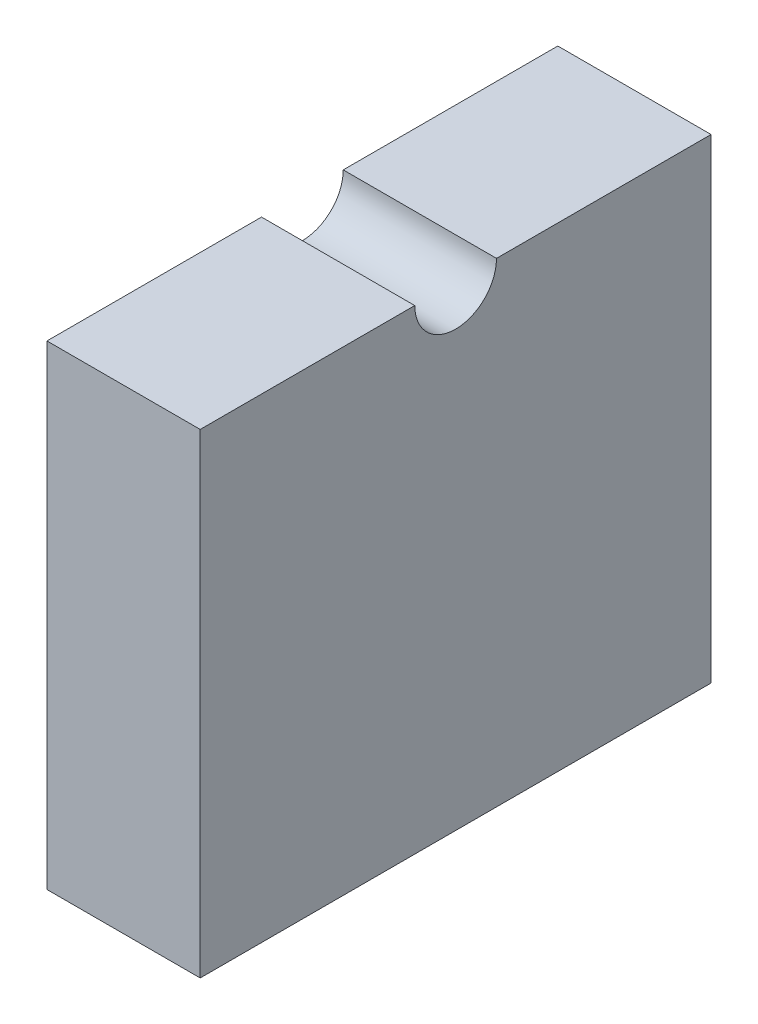
ISO-10303-21;
HEADER;
FILE_DESCRIPTION(('STEP AP214'),'2;1');
FILE_NAME('part.step','',(''),(''),'','','');
FILE_SCHEMA(('AUTOMOTIVE_DESIGN { 1 0 10303 214 1 1 1 1 }'));
ENDSEC;
DATA;
#1=APPLICATION_CONTEXT('core data for automotive mechanical design processes');
#2=APPLICATION_PROTOCOL_DEFINITION('international standard','automotive_design',2000,#1);
#3=PRODUCT_CONTEXT('',#1,'mechanical');
#4=PRODUCT('Part','Part','',(#3));
#5=PRODUCT_RELATED_PRODUCT_CATEGORY('part','',(#4));
#6=PRODUCT_DEFINITION_FORMATION('','',#4);
#7=PRODUCT_DEFINITION_CONTEXT('part definition',#1,'design');
#8=PRODUCT_DEFINITION('design','',#6,#7);
#9=PRODUCT_DEFINITION_SHAPE('','',#8);
#10=(LENGTH_UNIT() NAMED_UNIT(*) SI_UNIT(.MILLI.,.METRE.));
#11=(NAMED_UNIT(*) PLANE_ANGLE_UNIT() SI_UNIT($,.RADIAN.));
#12=(NAMED_UNIT(*) SI_UNIT($,.STERADIAN.) SOLID_ANGLE_UNIT());
#13=UNCERTAINTY_MEASURE_WITH_UNIT(LENGTH_MEASURE(1.E-05),#10,'distance_accuracy_value','');
#14=(GEOMETRIC_REPRESENTATION_CONTEXT(3) GLOBAL_UNCERTAINTY_ASSIGNED_CONTEXT((#13)) GLOBAL_UNIT_ASSIGNED_CONTEXT((#10,
#11,#12)) REPRESENTATION_CONTEXT('',''));
#15=CARTESIAN_POINT('',(0.,0.,0.));
#16=DIRECTION('',(0.,0.,1.));
#17=DIRECTION('',(1.,0.,0.));
#18=AXIS2_PLACEMENT_3D('',#15,#16,#17);
#19=CARTESIAN_POINT('',(15.,23.25,-25.));
#20=DIRECTION('',(0.,0.,1.));
#21=DIRECTION('',(0.,-1.,0.));
#22=AXIS2_PLACEMENT_3D('',#19,#20,#21);
#23=PLANE('',#22);
#24=DIRECTION('',(0.,1.,0.));
#25=VECTOR('',#24,1.);
#26=CARTESIAN_POINT('',(0.,23.25,-25.));
#27=LINE('',#26,#25);
#28=CARTESIAN_POINT('',(0.,-23.25,-25.));
#29=VERTEX_POINT('',#28);
#30=CARTESIAN_POINT('',(0.,23.25,-25.));
#31=VERTEX_POINT('',#30);
#32=EDGE_CURVE('E117',#29,#31,#27,.T.);
#33=ORIENTED_EDGE('',*,*,#32,.T.);
#34=DIRECTION('',(-1.,0.,0.));
#35=VECTOR('',#34,1.);
#36=CARTESIAN_POINT('',(15.,23.25,-25.));
#37=LINE('',#36,#35);
#38=CARTESIAN_POINT('',(15.,23.25,-25.));
#39=VERTEX_POINT('',#38);
#40=EDGE_CURVE('E11',#39,#31,#37,.T.);
#41=ORIENTED_EDGE('',*,*,#40,.F.);
#42=DIRECTION('',(0.,1.,0.));
#43=VECTOR('',#42,1.);
#44=CARTESIAN_POINT('',(15.,23.25,-25.));
#45=LINE('',#44,#43);
#46=CARTESIAN_POINT('',(15.,-23.25,-25.));
#47=VERTEX_POINT('',#46);
#48=EDGE_CURVE('E127',#47,#39,#45,.T.);
#49=ORIENTED_EDGE('',*,*,#48,.F.);
#50=DIRECTION('',(-1.,0.,0.));
#51=VECTOR('',#50,1.);
#52=CARTESIAN_POINT('',(15.,-23.25,-25.));
#53=LINE('',#52,#51);
#54=EDGE_CURVE('E113',#47,#29,#53,.T.);
#55=ORIENTED_EDGE('',*,*,#54,.T.);
#56=EDGE_LOOP('',(#33,#41,#49,#55));
#57=FACE_BOUND('',#56,.T.);
#58=ADVANCED_FACE('F33',(#57),#23,.F.);
#59=CARTESIAN_POINT('',(15.,23.25,-4.));
#60=DIRECTION('',(0.,-1.,0.));
#61=DIRECTION('',(0.,0.,-1.));
#62=AXIS2_PLACEMENT_3D('',#59,#60,#61);
#63=PLANE('',#62);
#64=DIRECTION('',(0.,0.,1.));
#65=VECTOR('',#64,1.);
#66=CARTESIAN_POINT('',(0.,23.25,-4.));
#67=LINE('',#66,#65);
#68=CARTESIAN_POINT('',(0.,23.25,-4.));
#69=VERTEX_POINT('',#68);
#70=EDGE_CURVE('E120',#31,#69,#67,.T.);
#71=ORIENTED_EDGE('',*,*,#70,.T.);
#72=DIRECTION('',(-1.,0.,0.));
#73=VECTOR('',#72,1.);
#74=CARTESIAN_POINT('',(15.,23.25,-4.));
#75=LINE('',#74,#73);
#76=CARTESIAN_POINT('',(15.,23.25,-4.));
#77=VERTEX_POINT('',#76);
#78=EDGE_CURVE('E41',#77,#69,#75,.T.);
#79=ORIENTED_EDGE('',*,*,#78,.F.);
#80=DIRECTION('',(0.,0.,1.));
#81=VECTOR('',#80,1.);
#82=CARTESIAN_POINT('',(15.,23.25,-4.));
#83=LINE('',#82,#81);
#84=EDGE_CURVE('E86',#39,#77,#83,.T.);
#85=ORIENTED_EDGE('',*,*,#84,.F.);
#86=ORIENTED_EDGE('',*,*,#40,.T.);
#87=EDGE_LOOP('',(#71,#79,#85,#86));
#88=FACE_BOUND('',#87,.T.);
#89=ADVANCED_FACE('F151',(#88),#63,.F.);
#90=CARTESIAN_POINT('',(15.,23.25,0.));
#91=DIRECTION('',(-1.,0.,0.));
#92=DIRECTION('',(0.,0.,1.));
#93=AXIS2_PLACEMENT_3D('',#90,#91,#92);
#94=CYLINDRICAL_SURFACE('',#93,4.);
#95=CARTESIAN_POINT('',(0.,23.25,0.));
#96=DIRECTION('',(-1.,0.,0.));
#97=DIRECTION('',(0.,0.,-1.));
#98=AXIS2_PLACEMENT_3D('',#95,#96,#97);
#99=CIRCLE('',#98,4.);
#100=CARTESIAN_POINT('',(0.,23.25,4.));
#101=VERTEX_POINT('',#100);
#102=EDGE_CURVE('E122',#69,#101,#99,.T.);
#103=ORIENTED_EDGE('',*,*,#102,.T.);
#104=DIRECTION('',(-1.,0.,0.));
#105=VECTOR('',#104,1.);
#106=CARTESIAN_POINT('',(15.,23.25,4.));
#107=LINE('',#106,#105);
#108=CARTESIAN_POINT('',(15.,23.25,4.));
#109=VERTEX_POINT('',#108);
#110=EDGE_CURVE('E108',#109,#101,#107,.T.);
#111=ORIENTED_EDGE('',*,*,#110,.F.);
#112=CARTESIAN_POINT('',(15.,23.25,0.));
#113=DIRECTION('',(-1.,0.,0.));
#114=DIRECTION('',(0.,0.,-1.));
#115=AXIS2_PLACEMENT_3D('',#112,#113,#114);
#116=CIRCLE('',#115,4.);
#117=EDGE_CURVE('E99',#77,#109,#116,.T.);
#118=ORIENTED_EDGE('',*,*,#117,.F.);
#119=ORIENTED_EDGE('',*,*,#78,.T.);
#120=EDGE_LOOP('',(#103,#111,#118,#119));
#121=FACE_BOUND('',#120,.T.);
#122=ADVANCED_FACE('F133',(#121),#94,.F.);
#123=CARTESIAN_POINT('',(15.,23.25,25.));
#124=DIRECTION('',(0.,-1.,0.));
#125=DIRECTION('',(0.,0.,-1.));
#126=AXIS2_PLACEMENT_3D('',#123,#124,#125);
#127=PLANE('',#126);
#128=DIRECTION('',(0.,0.,1.));
#129=VECTOR('',#128,1.);
#130=CARTESIAN_POINT('',(0.,23.25,25.));
#131=LINE('',#130,#129);
#132=CARTESIAN_POINT('',(0.,23.25,25.));
#133=VERTEX_POINT('',#132);
#134=EDGE_CURVE('E107',#101,#133,#131,.T.);
#135=ORIENTED_EDGE('',*,*,#134,.T.);
#136=DIRECTION('',(-1.,0.,0.));
#137=VECTOR('',#136,1.);
#138=CARTESIAN_POINT('',(15.,23.25,25.));
#139=LINE('',#138,#137);
#140=CARTESIAN_POINT('',(15.,23.25,25.));
#141=VERTEX_POINT('',#140);
#142=EDGE_CURVE('E104',#141,#133,#139,.T.);
#143=ORIENTED_EDGE('',*,*,#142,.F.);
#144=DIRECTION('',(0.,0.,1.));
#145=VECTOR('',#144,1.);
#146=CARTESIAN_POINT('',(15.,23.25,25.));
#147=LINE('',#146,#145);
#148=EDGE_CURVE('E93',#109,#141,#147,.T.);
#149=ORIENTED_EDGE('',*,*,#148,.F.);
#150=ORIENTED_EDGE('',*,*,#110,.T.);
#151=EDGE_LOOP('',(#135,#143,#149,#150));
#152=FACE_BOUND('',#151,.T.);
#153=ADVANCED_FACE('F105',(#152),#127,.F.);
#154=CARTESIAN_POINT('',(15.,23.25,25.));
#155=DIRECTION('',(0.,0.,-1.));
#156=DIRECTION('',(0.,1.,0.));
#157=AXIS2_PLACEMENT_3D('',#154,#155,#156);
#158=PLANE('',#157);
#159=DIRECTION('',(0.,-1.,0.));
#160=VECTOR('',#159,1.);
#161=CARTESIAN_POINT('',(0.,23.25,25.));
#162=LINE('',#161,#160);
#163=CARTESIAN_POINT('',(0.,-23.25,25.));
#164=VERTEX_POINT('',#163);
#165=EDGE_CURVE('E72',#133,#164,#162,.T.);
#166=ORIENTED_EDGE('',*,*,#165,.T.);
#167=DIRECTION('',(-1.,0.,0.));
#168=VECTOR('',#167,1.);
#169=CARTESIAN_POINT('',(15.,-23.25,25.));
#170=LINE('',#169,#168);
#171=CARTESIAN_POINT('',(15.,-23.25,25.));
#172=VERTEX_POINT('',#171);
#173=EDGE_CURVE('E109',#172,#164,#170,.T.);
#174=ORIENTED_EDGE('',*,*,#173,.F.);
#175=DIRECTION('',(0.,-1.,0.));
#176=VECTOR('',#175,1.);
#177=CARTESIAN_POINT('',(15.,23.25,25.));
#178=LINE('',#177,#176);
#179=EDGE_CURVE('E97',#141,#172,#178,.T.);
#180=ORIENTED_EDGE('',*,*,#179,.F.);
#181=ORIENTED_EDGE('',*,*,#142,.T.);
#182=EDGE_LOOP('',(#166,#174,#180,#181));
#183=FACE_BOUND('',#182,.T.);
#184=ADVANCED_FACE('F111',(#183),#158,.F.);
#185=CARTESIAN_POINT('',(15.,-23.25,25.));
#186=DIRECTION('',(0.,1.,0.));
#187=DIRECTION('',(0.,0.,1.));
#188=AXIS2_PLACEMENT_3D('',#185,#186,#187);
#189=PLANE('',#188);
#190=DIRECTION('',(0.,0.,-1.));
#191=VECTOR('',#190,1.);
#192=CARTESIAN_POINT('',(0.,-23.25,25.));
#193=LINE('',#192,#191);
#194=EDGE_CURVE('E78',#164,#29,#193,.T.);
#195=ORIENTED_EDGE('',*,*,#194,.T.);
#196=ORIENTED_EDGE('',*,*,#54,.F.);
#197=DIRECTION('',(0.,0.,-1.));
#198=VECTOR('',#197,1.);
#199=CARTESIAN_POINT('',(15.,-23.25,25.));
#200=LINE('',#199,#198);
#201=EDGE_CURVE('E49',#172,#47,#200,.T.);
#202=ORIENTED_EDGE('',*,*,#201,.F.);
#203=ORIENTED_EDGE('',*,*,#173,.T.);
#204=EDGE_LOOP('',(#195,#196,#202,#203));
#205=FACE_BOUND('',#204,.T.);
#206=ADVANCED_FACE('F140',(#205),#189,.F.);
#207=CARTESIAN_POINT('',(15.,23.25,0.));
#208=DIRECTION('',(1.,0.,0.));
#209=DIRECTION('',(0.,0.,-1.));
#210=AXIS2_PLACEMENT_3D('',#207,#208,#209);
#211=PLANE('',#210);
#212=ORIENTED_EDGE('',*,*,#48,.T.);
#213=ORIENTED_EDGE('',*,*,#84,.T.);
#214=ORIENTED_EDGE('',*,*,#117,.T.);
#215=ORIENTED_EDGE('',*,*,#148,.T.);
#216=ORIENTED_EDGE('',*,*,#179,.T.);
#217=ORIENTED_EDGE('',*,*,#201,.T.);
#218=EDGE_LOOP('',(#212,#213,#214,#215,#216,#217));
#219=FACE_BOUND('',#218,.T.);
#220=ADVANCED_FACE('F95',(#219),#211,.T.);
#221=CARTESIAN_POINT('',(0.,23.25,0.));
#222=DIRECTION('',(1.,0.,0.));
#223=DIRECTION('',(0.,0.,-1.));
#224=AXIS2_PLACEMENT_3D('',#221,#222,#223);
#225=PLANE('',#224);
#226=ORIENTED_EDGE('',*,*,#32,.F.);
#227=ORIENTED_EDGE('',*,*,#194,.F.);
#228=ORIENTED_EDGE('',*,*,#165,.F.);
#229=ORIENTED_EDGE('',*,*,#134,.F.);
#230=ORIENTED_EDGE('',*,*,#102,.F.);
#231=ORIENTED_EDGE('',*,*,#70,.F.);
#232=EDGE_LOOP('',(#226,#227,#228,#229,#230,#231));
#233=FACE_BOUND('',#232,.T.);
#234=ADVANCED_FACE('F136',(#233),#225,.F.);
#235=CLOSED_SHELL('',(#58,#89,#122,#153,#184,#206,#220,#234));
#236=MANIFOLD_SOLID_BREP('B2',#235);
#237=ADVANCED_BREP_SHAPE_REPRESENTATION('',(#18,#236),#14);
#238=SHAPE_DEFINITION_REPRESENTATION(#9,#237);
ENDSEC;
END-ISO-10303-21;
